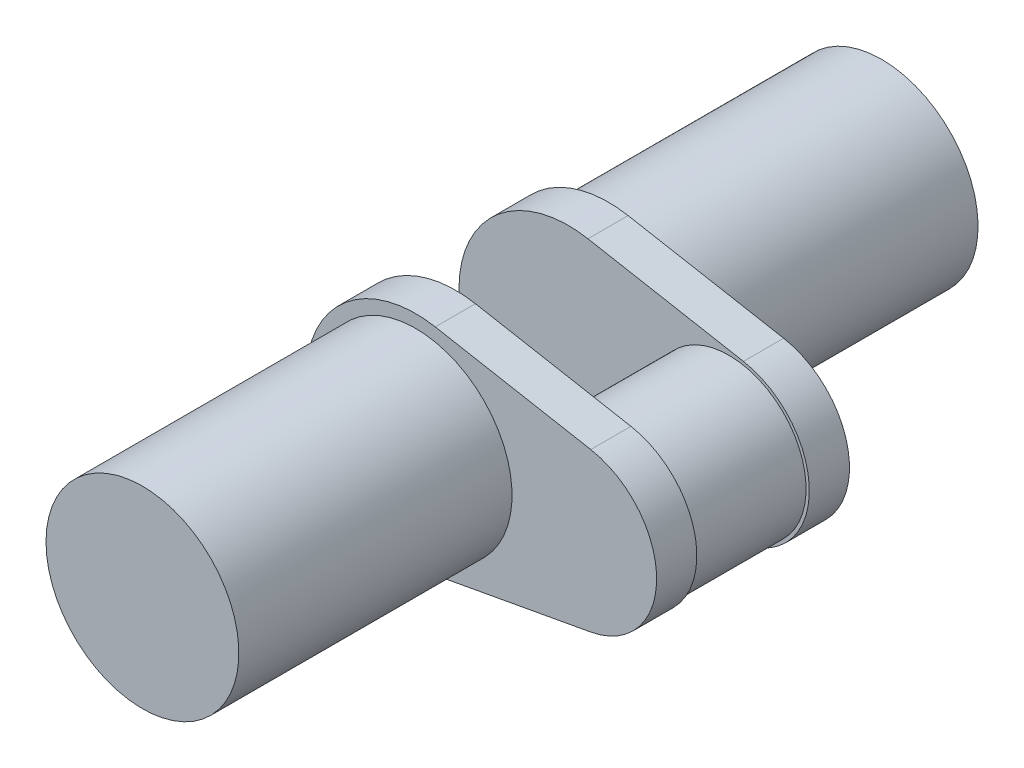
ISO-10303-21;
HEADER;
FILE_DESCRIPTION(('STEP AP214'),'2;1');
FILE_NAME('part.step','',(''),(''),'','','');
FILE_SCHEMA(('AUTOMOTIVE_DESIGN { 1 0 10303 214 1 1 1 1 }'));
ENDSEC;
DATA;
#1=APPLICATION_CONTEXT('core data for automotive mechanical design processes');
#2=APPLICATION_PROTOCOL_DEFINITION('international standard','automotive_design',2000,#1);
#3=PRODUCT_CONTEXT('',#1,'mechanical');
#4=PRODUCT('Part','Part','',(#3));
#5=PRODUCT_RELATED_PRODUCT_CATEGORY('part','',(#4));
#6=PRODUCT_DEFINITION_FORMATION('','',#4);
#7=PRODUCT_DEFINITION_CONTEXT('part definition',#1,'design');
#8=PRODUCT_DEFINITION('design','',#6,#7);
#9=PRODUCT_DEFINITION_SHAPE('','',#8);
#10=(LENGTH_UNIT() NAMED_UNIT(*) SI_UNIT(.MILLI.,.METRE.));
#11=(NAMED_UNIT(*) PLANE_ANGLE_UNIT() SI_UNIT($,.RADIAN.));
#12=(NAMED_UNIT(*) SI_UNIT($,.STERADIAN.) SOLID_ANGLE_UNIT());
#13=UNCERTAINTY_MEASURE_WITH_UNIT(LENGTH_MEASURE(1.E-05),#10,'distance_accuracy_value','');
#14=(GEOMETRIC_REPRESENTATION_CONTEXT(3) GLOBAL_UNCERTAINTY_ASSIGNED_CONTEXT((#13)) GLOBAL_UNIT_ASSIGNED_CONTEXT((#10,
#11,#12)) REPRESENTATION_CONTEXT('',''));
#15=CARTESIAN_POINT('',(0.,0.,0.));
#16=DIRECTION('',(0.,0.,1.));
#17=DIRECTION('',(1.,0.,0.));
#18=AXIS2_PLACEMENT_3D('',#15,#16,#17);
#19=CARTESIAN_POINT('',(-19.2786,-19.2786,0.));
#20=DIRECTION('',(0.,0.,1.));
#21=DIRECTION('',(1.,0.,0.));
#22=AXIS2_PLACEMENT_3D('',#19,#20,#21);
#23=PLANE('',#22);
#24=CARTESIAN_POINT('',(0.,0.,0.));
#25=DIRECTION('',(0.,0.,-1.));
#26=DIRECTION('',(-1.,0.,0.));
#27=AXIS2_PLACEMENT_3D('',#24,#25,#26);
#28=CIRCLE('',#27,19.05);
#29=CARTESIAN_POINT('',(-19.05,0.,0.));
#30=VERTEX_POINT('',#29);
#31=EDGE_CURVE('E20',#30,#30,#28,.F.);
#32=ORIENTED_EDGE('',*,*,#31,.T.);
#33=EDGE_LOOP('',(#32));
#34=FACE_BOUND('',#33,.T.);
#35=ADVANCED_FACE('F16',(#34),#23,.T.);
#36=CARTESIAN_POINT('',(0.,0.,0.));
#37=DIRECTION('',(0.,0.,-1.));
#38=DIRECTION('',(-1.,0.,0.));
#39=AXIS2_PLACEMENT_3D('',#36,#37,#38);
#40=CYLINDRICAL_SURFACE('',#39,19.05);
#41=CARTESIAN_POINT('',(0.,0.,-53.975));
#42=DIRECTION('',(0.,0.,-1.));
#43=DIRECTION('',(-1.,0.,0.));
#44=AXIS2_PLACEMENT_3D('',#41,#42,#43);
#45=CIRCLE('',#44,19.05);
#46=CARTESIAN_POINT('',(-19.05,0.,-53.975));
#47=VERTEX_POINT('',#46);
#48=EDGE_CURVE('E89',#47,#47,#45,.F.);
#49=ORIENTED_EDGE('',*,*,#48,.T.);
#50=EDGE_LOOP('',(#49));
#51=FACE_BOUND('',#50,.T.);
#52=ORIENTED_EDGE('',*,*,#31,.F.);
#53=EDGE_LOOP('',(#52));
#54=FACE_BOUND('',#53,.T.);
#55=ADVANCED_FACE('F153',(#51,#54),#40,.T.);
#56=CARTESIAN_POINT('',(48.04029,-21.84908,-53.975));
#57=DIRECTION('',(0.,0.,-1.));
#58=DIRECTION('',(-1.,0.,0.));
#59=AXIS2_PLACEMENT_3D('',#56,#57,#58);
#60=PLANE('',#59);
#61=ORIENTED_EDGE('',*,*,#48,.F.);
#62=EDGE_LOOP('',(#61));
#63=FACE_BOUND('',#62,.T.);
#64=DIRECTION('',(-0.983666610086747,-0.1800000005568,0.));
#65=VECTOR('',#64,1.);
#66=CARTESIAN_POINT('',(19.24685,-18.426534775,-53.975));
#67=LINE('',#66,#65);
#68=CARTESIAN_POINT('',(34.6075000035923,-15.6157074267427,-53.975));
#69=VERTEX_POINT('',#68);
#70=CARTESIAN_POINT('',(3.88620000677444,-21.2373621213604,-53.975));
#71=VERTEX_POINT('',#70);
#72=EDGE_CURVE('E107',#69,#71,#67,.T.);
#73=ORIENTED_EDGE('',*,*,#72,.F.);
#74=CARTESIAN_POINT('',(31.75,0.,-53.975));
#75=DIRECTION('',(0.,0.,-1.));
#76=DIRECTION('',(0.,1.,0.));
#77=AXIS2_PLACEMENT_3D('',#74,#75,#76);
#78=CIRCLE('',#77,15.875);
#79=CARTESIAN_POINT('',(34.6075000032687,15.6157074314742,-53.975));
#80=VERTEX_POINT('',#79);
#81=EDGE_CURVE('E94',#69,#80,#78,.F.);
#82=ORIENTED_EDGE('',*,*,#81,.T.);
#83=DIRECTION('',(0.983666610086747,-0.1800000005568,0.));
#84=VECTOR('',#83,1.);
#85=CARTESIAN_POINT('',(19.24685,18.426534775,-53.975));
#86=LINE('',#85,#84);
#87=CARTESIAN_POINT('',(3.88620000677444,21.2373621213604,-53.975));
#88=VERTEX_POINT('',#87);
#89=EDGE_CURVE('E92',#88,#80,#86,.T.);
#90=ORIENTED_EDGE('',*,*,#89,.F.);
#91=CARTESIAN_POINT('',(0.,0.,-53.975));
#92=DIRECTION('',(0.,0.,-1.));
#93=DIRECTION('',(0.,1.,0.));
#94=AXIS2_PLACEMENT_3D('',#91,#92,#93);
#95=CIRCLE('',#94,21.59);
#96=EDGE_CURVE('E78',#88,#71,#95,.F.);
#97=ORIENTED_EDGE('',*,*,#96,.T.);
#98=EDGE_LOOP('',(#73,#82,#90,#97));
#99=FACE_BOUND('',#98,.T.);
#100=ADVANCED_FACE('F93',(#63,#99),#60,.F.);
#101=CARTESIAN_POINT('',(0.,0.,-53.975));
#102=DIRECTION('',(0.,0.,-1.));
#103=DIRECTION('',(0.,1.,0.));
#104=AXIS2_PLACEMENT_3D('',#101,#102,#103);
#105=CYLINDRICAL_SURFACE('',#104,21.59);
#106=ORIENTED_EDGE('',*,*,#96,.F.);
#107=DIRECTION('',(0.,0.,1.));
#108=VECTOR('',#107,1.);
#109=CARTESIAN_POINT('',(3.8862,21.2373621226,-57.94375));
#110=LINE('',#109,#108);
#111=CARTESIAN_POINT('',(3.88620001567664,21.2373621263321,-61.9125));
#112=VERTEX_POINT('',#111);
#113=EDGE_CURVE('E82',#112,#88,#110,.T.);
#114=ORIENTED_EDGE('',*,*,#113,.F.);
#115=CARTESIAN_POINT('',(0.,0.,-61.9125));
#116=DIRECTION('',(0.,0.,-1.));
#117=DIRECTION('',(0.,1.,0.));
#118=AXIS2_PLACEMENT_3D('',#115,#116,#117);
#119=CIRCLE('',#118,21.59);
#120=CARTESIAN_POINT('',(3.88620001567664,-21.2373621263321,-61.9125));
#121=VERTEX_POINT('',#120);
#122=EDGE_CURVE('E144',#121,#112,#119,.T.);
#123=ORIENTED_EDGE('',*,*,#122,.F.);
#124=DIRECTION('',(0.,0.,-1.));
#125=VECTOR('',#124,1.);
#126=CARTESIAN_POINT('',(3.8862,-21.2373621226,-57.94375));
#127=LINE('',#126,#125);
#128=EDGE_CURVE('E85',#71,#121,#127,.T.);
#129=ORIENTED_EDGE('',*,*,#128,.F.);
#130=EDGE_LOOP('',(#106,#114,#123,#129));
#131=FACE_BOUND('',#130,.T.);
#132=ADVANCED_FACE('F80',(#131),#105,.T.);
#133=CARTESIAN_POINT('',(34.6075,15.6157074274,-61.9125));
#134=DIRECTION('',(0.1800000005568,0.983666610086747,0.));
#135=DIRECTION('',(-0.983666610086747,0.1800000005568,0.));
#136=AXIS2_PLACEMENT_3D('',#133,#134,#135);
#137=PLANE('',#136);
#138=ORIENTED_EDGE('',*,*,#89,.T.);
#139=DIRECTION('',(0.,0.,1.));
#140=VECTOR('',#139,1.);
#141=CARTESIAN_POINT('',(34.6074999993528,15.615707436863,-57.94375));
#142=LINE('',#141,#140);
#143=CARTESIAN_POINT('',(34.6075000080767,15.6157074256334,-61.9125));
#144=VERTEX_POINT('',#143);
#145=EDGE_CURVE('E105',#80,#144,#142,.F.);
#146=ORIENTED_EDGE('',*,*,#145,.T.);
#147=DIRECTION('',(0.983666609955655,-0.180000001273195,0.));
#148=VECTOR('',#147,1.);
#149=CARTESIAN_POINT('',(3.88620002828036,21.2373621306264,-61.9125));
#150=LINE('',#149,#148);
#151=EDGE_CURVE('E100',#112,#144,#150,.T.);
#152=ORIENTED_EDGE('',*,*,#151,.F.);
#153=ORIENTED_EDGE('',*,*,#113,.T.);
#154=EDGE_LOOP('',(#138,#146,#152,#153));
#155=FACE_BOUND('',#154,.T.);
#156=ADVANCED_FACE('F98',(#155),#137,.T.);
#157=CARTESIAN_POINT('',(31.75,0.,-53.975));
#158=DIRECTION('',(0.,0.,-1.));
#159=DIRECTION('',(0.,1.,0.));
#160=AXIS2_PLACEMENT_3D('',#157,#158,#159);
#161=CYLINDRICAL_SURFACE('',#160,15.875);
#162=ORIENTED_EDGE('',*,*,#145,.F.);
#163=ORIENTED_EDGE('',*,*,#81,.F.);
#164=DIRECTION('',(0.,0.,1.));
#165=VECTOR('',#164,1.);
#166=CARTESIAN_POINT('',(34.6075,-15.6157074274,-57.94375));
#167=LINE('',#166,#165);
#168=CARTESIAN_POINT('',(34.6075000084003,-15.6157074209019,-61.9125));
#169=VERTEX_POINT('',#168);
#170=EDGE_CURVE('E108',#169,#69,#167,.T.);
#171=ORIENTED_EDGE('',*,*,#170,.F.);
#172=CARTESIAN_POINT('',(31.75,0.,-61.9125));
#173=DIRECTION('',(0.,0.,-1.));
#174=DIRECTION('',(0.,1.,0.));
#175=AXIS2_PLACEMENT_3D('',#172,#173,#174);
#176=CIRCLE('',#175,15.875);
#177=EDGE_CURVE('E140',#144,#169,#176,.T.);
#178=ORIENTED_EDGE('',*,*,#177,.F.);
#179=EDGE_LOOP('',(#162,#163,#171,#178));
#180=FACE_BOUND('',#179,.T.);
#181=ADVANCED_FACE('F192',(#180),#161,.T.);
#182=CARTESIAN_POINT('',(3.8862,-21.2373621226,-61.9125));
#183=DIRECTION('',(0.1800000005568,-0.983666610086747,0.));
#184=DIRECTION('',(0.983666610086747,0.1800000005568,0.));
#185=AXIS2_PLACEMENT_3D('',#182,#183,#184);
#186=PLANE('',#185);
#187=ORIENTED_EDGE('',*,*,#72,.T.);
#188=ORIENTED_EDGE('',*,*,#128,.T.);
#189=DIRECTION('',(-0.983666609955655,-0.180000001273195,0.));
#190=VECTOR('',#189,1.);
#191=CARTESIAN_POINT('',(34.6074999963602,-15.6157074181442,-61.9125));
#192=LINE('',#191,#190);
#193=EDGE_CURVE('E137',#169,#121,#192,.T.);
#194=ORIENTED_EDGE('',*,*,#193,.F.);
#195=ORIENTED_EDGE('',*,*,#170,.T.);
#196=EDGE_LOOP('',(#187,#188,#194,#195));
#197=FACE_BOUND('',#196,.T.);
#198=ADVANCED_FACE('F194',(#197),#186,.T.);
#199=CARTESIAN_POINT('',(48.04029,-21.84908,-61.9125));
#200=DIRECTION('',(0.,0.,-1.));
#201=DIRECTION('',(-1.,0.,0.));
#202=AXIS2_PLACEMENT_3D('',#199,#200,#201);
#203=PLANE('',#202);
#204=CARTESIAN_POINT('',(31.75,0.,-61.9125));
#205=DIRECTION('',(0.,0.,-1.));
#206=DIRECTION('',(-1.,0.,0.));
#207=AXIS2_PLACEMENT_3D('',#204,#205,#206);
#208=CIRCLE('',#207,15.24);
#209=CARTESIAN_POINT('',(16.51,0.,-61.9125));
#210=VERTEX_POINT('',#209);
#211=EDGE_CURVE('E134',#210,#210,#208,.F.);
#212=ORIENTED_EDGE('',*,*,#211,.T.);
#213=EDGE_LOOP('',(#212));
#214=FACE_BOUND('',#213,.T.);
#215=ORIENTED_EDGE('',*,*,#177,.T.);
#216=ORIENTED_EDGE('',*,*,#193,.T.);
#217=ORIENTED_EDGE('',*,*,#122,.T.);
#218=ORIENTED_EDGE('',*,*,#151,.T.);
#219=EDGE_LOOP('',(#215,#216,#217,#218));
#220=FACE_BOUND('',#219,.T.);
#221=ADVANCED_FACE('F190',(#214,#220),#203,.T.);
#222=CARTESIAN_POINT('',(31.75,0.,-61.9125));
#223=DIRECTION('',(0.,0.,-1.));
#224=DIRECTION('',(-1.,0.,0.));
#225=AXIS2_PLACEMENT_3D('',#222,#223,#224);
#226=CYLINDRICAL_SURFACE('',#225,15.24);
#227=ORIENTED_EDGE('',*,*,#211,.F.);
#228=EDGE_LOOP('',(#227));
#229=FACE_BOUND('',#228,.T.);
#230=CARTESIAN_POINT('',(31.75,0.,-84.1375));
#231=DIRECTION('',(0.,0.,-1.));
#232=DIRECTION('',(-1.,0.,0.));
#233=AXIS2_PLACEMENT_3D('',#230,#231,#232);
#234=CIRCLE('',#233,15.24);
#235=CARTESIAN_POINT('',(16.51,0.,-84.1375));
#236=VERTEX_POINT('',#235);
#237=EDGE_CURVE('E131',#236,#236,#234,.F.);
#238=ORIENTED_EDGE('',*,*,#237,.T.);
#239=EDGE_LOOP('',(#238));
#240=FACE_BOUND('',#239,.T.);
#241=ADVANCED_FACE('F187',(#229,#240),#226,.T.);
#242=CARTESIAN_POINT('',(48.04029,-21.84908,-84.1375));
#243=DIRECTION('',(0.,0.,-1.));
#244=DIRECTION('',(-1.,0.,0.));
#245=AXIS2_PLACEMENT_3D('',#242,#243,#244);
#246=PLANE('',#245);
#247=ORIENTED_EDGE('',*,*,#237,.F.);
#248=EDGE_LOOP('',(#247));
#249=FACE_BOUND('',#248,.T.);
#250=DIRECTION('',(0.983666610086747,-0.1800000005568,0.));
#251=VECTOR('',#250,1.);
#252=CARTESIAN_POINT('',(19.24685,18.426534775,-84.1375));
#253=LINE('',#252,#251);
#254=CARTESIAN_POINT('',(3.88620000677444,21.2373621213604,-84.1375));
#255=VERTEX_POINT('',#254);
#256=CARTESIAN_POINT('',(34.6075000035923,15.6157074267427,-84.1375));
#257=VERTEX_POINT('',#256);
#258=EDGE_CURVE('E324',#255,#257,#253,.T.);
#259=ORIENTED_EDGE('',*,*,#258,.F.);
#260=CARTESIAN_POINT('',(0.,0.,-84.1375));
#261=DIRECTION('',(0.,0.,-1.));
#262=DIRECTION('',(-1.,0.,0.));
#263=AXIS2_PLACEMENT_3D('',#260,#261,#262);
#264=CIRCLE('',#263,21.59);
#265=CARTESIAN_POINT('',(3.88620000824132,-21.2373621167783,-84.1375));
#266=VERTEX_POINT('',#265);
#267=EDGE_CURVE('E125',#255,#266,#264,.F.);
#268=ORIENTED_EDGE('',*,*,#267,.T.);
#269=DIRECTION('',(-0.983666610086747,-0.1800000005568,0.));
#270=VECTOR('',#269,1.);
#271=CARTESIAN_POINT('',(19.24685,-18.426534775,-84.1375));
#272=LINE('',#271,#270);
#273=CARTESIAN_POINT('',(34.6075000035923,-15.6157074267427,-84.1375));
#274=VERTEX_POINT('',#273);
#275=EDGE_CURVE('E333',#274,#266,#272,.T.);
#276=ORIENTED_EDGE('',*,*,#275,.F.);
#277=CARTESIAN_POINT('',(31.75,0.,-84.1375));
#278=DIRECTION('',(0.,0.,-1.));
#279=DIRECTION('',(-1.,0.,0.));
#280=AXIS2_PLACEMENT_3D('',#277,#278,#279);
#281=CIRCLE('',#280,15.875);
#282=EDGE_CURVE('E128',#274,#257,#281,.F.);
#283=ORIENTED_EDGE('',*,*,#282,.T.);
#284=EDGE_LOOP('',(#259,#268,#276,#283));
#285=FACE_BOUND('',#284,.T.);
#286=ADVANCED_FACE('F185',(#249,#285),#246,.F.);
#287=CARTESIAN_POINT('',(31.75,0.,-84.1375));
#288=DIRECTION('',(0.,0.,-1.));
#289=DIRECTION('',(-1.,0.,0.));
#290=AXIS2_PLACEMENT_3D('',#287,#288,#289);
#291=CYLINDRICAL_SURFACE('',#290,15.875);
#292=DIRECTION('',(0.,0.,-1.));
#293=VECTOR('',#292,1.);
#294=CARTESIAN_POINT('',(34.6075,15.6157074274,-88.10625));
#295=LINE('',#294,#293);
#296=CARTESIAN_POINT('',(34.6075000084003,15.6157074209019,-92.075));
#297=VERTEX_POINT('',#296);
#298=EDGE_CURVE('E124',#257,#297,#295,.T.);
#299=ORIENTED_EDGE('',*,*,#298,.F.);
#300=ORIENTED_EDGE('',*,*,#282,.F.);
#301=DIRECTION('',(0.,0.,1.));
#302=VECTOR('',#301,1.);
#303=CARTESIAN_POINT('',(34.6075,-15.6157074274,-88.10625));
#304=LINE('',#303,#302);
#305=CARTESIAN_POINT('',(34.6075000084003,-15.6157074209019,-92.075));
#306=VERTEX_POINT('',#305);
#307=EDGE_CURVE('E130',#306,#274,#304,.T.);
#308=ORIENTED_EDGE('',*,*,#307,.F.);
#309=CARTESIAN_POINT('',(31.75,0.,-92.075));
#310=DIRECTION('',(0.,0.,-1.));
#311=DIRECTION('',(-1.,0.,0.));
#312=AXIS2_PLACEMENT_3D('',#309,#310,#311);
#313=CIRCLE('',#312,15.875);
#314=EDGE_CURVE('E121',#297,#306,#313,.T.);
#315=ORIENTED_EDGE('',*,*,#314,.F.);
#316=EDGE_LOOP('',(#299,#300,#308,#315));
#317=FACE_BOUND('',#316,.T.);
#318=ADVANCED_FACE('F182',(#317),#291,.T.);
#319=CARTESIAN_POINT('',(3.8862,-21.2373621226,-92.075));
#320=DIRECTION('',(0.1800000005568,-0.983666610086747,0.));
#321=DIRECTION('',(0.983666610086747,0.1800000005568,0.));
#322=AXIS2_PLACEMENT_3D('',#319,#320,#321);
#323=PLANE('',#322);
#324=ORIENTED_EDGE('',*,*,#275,.T.);
#325=DIRECTION('',(0.,0.,1.));
#326=VECTOR('',#325,1.);
#327=CARTESIAN_POINT('',(3.88620000293377,-21.2373621134358,-88.10625));
#328=LINE('',#327,#326);
#329=CARTESIAN_POINT('',(3.88620001714352,-21.2373621217499,-92.075));
#330=VERTEX_POINT('',#329);
#331=EDGE_CURVE('E127',#266,#330,#328,.F.);
#332=ORIENTED_EDGE('',*,*,#331,.T.);
#333=DIRECTION('',(-0.983666609955655,-0.180000001273195,0.));
#334=VECTOR('',#333,1.);
#335=CARTESIAN_POINT('',(34.6074999963602,-15.6157074181442,-92.075));
#336=LINE('',#335,#334);
#337=EDGE_CURVE('E118',#306,#330,#336,.T.);
#338=ORIENTED_EDGE('',*,*,#337,.F.);
#339=ORIENTED_EDGE('',*,*,#307,.T.);
#340=EDGE_LOOP('',(#324,#332,#338,#339));
#341=FACE_BOUND('',#340,.T.);
#342=ADVANCED_FACE('F181',(#341),#323,.T.);
#343=CARTESIAN_POINT('',(0.,0.,-84.1375));
#344=DIRECTION('',(0.,0.,-1.));
#345=DIRECTION('',(-1.,0.,0.));
#346=AXIS2_PLACEMENT_3D('',#343,#344,#345);
#347=CYLINDRICAL_SURFACE('',#346,21.59);
#348=ORIENTED_EDGE('',*,*,#267,.F.);
#349=DIRECTION('',(0.,0.,1.));
#350=VECTOR('',#349,1.);
#351=CARTESIAN_POINT('',(3.8862,21.2373621226,-88.10625));
#352=LINE('',#351,#350);
#353=CARTESIAN_POINT('',(3.88620001567664,21.2373621263321,-92.075));
#354=VERTEX_POINT('',#353);
#355=EDGE_CURVE('E35',#354,#255,#352,.T.);
#356=ORIENTED_EDGE('',*,*,#355,.F.);
#357=CARTESIAN_POINT('',(0.,0.,-92.075));
#358=DIRECTION('',(0.,0.,-1.));
#359=DIRECTION('',(-1.,0.,0.));
#360=AXIS2_PLACEMENT_3D('',#357,#358,#359);
#361=CIRCLE('',#360,21.59);
#362=EDGE_CURVE('E115',#330,#354,#361,.T.);
#363=ORIENTED_EDGE('',*,*,#362,.F.);
#364=ORIENTED_EDGE('',*,*,#331,.F.);
#365=EDGE_LOOP('',(#348,#356,#363,#364));
#366=FACE_BOUND('',#365,.T.);
#367=ADVANCED_FACE('F177',(#366),#347,.T.);
#368=CARTESIAN_POINT('',(34.6075,15.6157074274,-92.075));
#369=DIRECTION('',(0.1800000005568,0.983666610086747,0.));
#370=DIRECTION('',(-0.983666610086747,0.1800000005568,0.));
#371=AXIS2_PLACEMENT_3D('',#368,#369,#370);
#372=PLANE('',#371);
#373=ORIENTED_EDGE('',*,*,#258,.T.);
#374=ORIENTED_EDGE('',*,*,#298,.T.);
#375=DIRECTION('',(0.983666609955655,-0.180000001273195,0.));
#376=VECTOR('',#375,1.);
#377=CARTESIAN_POINT('',(3.88620002828036,21.2373621306264,-92.075));
#378=LINE('',#377,#376);
#379=EDGE_CURVE('E112',#354,#297,#378,.T.);
#380=ORIENTED_EDGE('',*,*,#379,.F.);
#381=ORIENTED_EDGE('',*,*,#355,.T.);
#382=EDGE_LOOP('',(#373,#374,#380,#381));
#383=FACE_BOUND('',#382,.T.);
#384=ADVANCED_FACE('F180',(#383),#372,.T.);
#385=CARTESIAN_POINT('',(19.2786,-19.2786,-146.05));
#386=DIRECTION('',(0.,0.,-1.));
#387=DIRECTION('',(-1.,0.,0.));
#388=AXIS2_PLACEMENT_3D('',#385,#386,#387);
#389=PLANE('',#388);
#390=CARTESIAN_POINT('',(0.,0.,-146.05));
#391=DIRECTION('',(0.,0.,-1.));
#392=DIRECTION('',(0.,1.,0.));
#393=AXIS2_PLACEMENT_3D('',#390,#391,#392);
#394=CIRCLE('',#393,19.05);
#395=CARTESIAN_POINT('',(0.,19.05,-146.05));
#396=VERTEX_POINT('',#395);
#397=EDGE_CURVE('E26',#396,#396,#394,.T.);
#398=ORIENTED_EDGE('',*,*,#397,.T.);
#399=EDGE_LOOP('',(#398));
#400=FACE_BOUND('',#399,.T.);
#401=ADVANCED_FACE('F172',(#400),#389,.T.);
#402=CARTESIAN_POINT('',(48.04029,-21.84908,-92.075));
#403=DIRECTION('',(0.,0.,-1.));
#404=DIRECTION('',(-1.,0.,0.));
#405=AXIS2_PLACEMENT_3D('',#402,#403,#404);
#406=PLANE('',#405);
#407=CARTESIAN_POINT('',(0.,0.,-92.075));
#408=DIRECTION('',(0.,0.,-1.));
#409=DIRECTION('',(0.,1.,0.));
#410=AXIS2_PLACEMENT_3D('',#407,#408,#409);
#411=CIRCLE('',#410,19.05);
#412=CARTESIAN_POINT('',(0.,19.05,-92.075));
#413=VERTEX_POINT('',#412);
#414=EDGE_CURVE('E11',#413,#413,#411,.F.);
#415=ORIENTED_EDGE('',*,*,#414,.T.);
#416=EDGE_LOOP('',(#415));
#417=FACE_BOUND('',#416,.T.);
#418=ORIENTED_EDGE('',*,*,#362,.T.);
#419=ORIENTED_EDGE('',*,*,#379,.T.);
#420=ORIENTED_EDGE('',*,*,#314,.T.);
#421=ORIENTED_EDGE('',*,*,#337,.T.);
#422=EDGE_LOOP('',(#418,#419,#420,#421));
#423=FACE_BOUND('',#422,.T.);
#424=ADVANCED_FACE('F18',(#417,#423),#406,.T.);
#425=CARTESIAN_POINT('',(0.,0.,-92.075));
#426=DIRECTION('',(0.,0.,-1.));
#427=DIRECTION('',(0.,1.,0.));
#428=AXIS2_PLACEMENT_3D('',#425,#426,#427);
#429=CYLINDRICAL_SURFACE('',#428,19.05);
#430=ORIENTED_EDGE('',*,*,#397,.F.);
#431=EDGE_LOOP('',(#430));
#432=FACE_BOUND('',#431,.T.);
#433=ORIENTED_EDGE('',*,*,#414,.F.);
#434=EDGE_LOOP('',(#433));
#435=FACE_BOUND('',#434,.T.);
#436=ADVANCED_FACE('F165',(#432,#435),#429,.T.);
#437=CLOSED_SHELL('',(#35,#55,#100,#132,#156,#181,#198,#221,#241,#286,#318,#342,#367,#384,#401,
#424,#436));
#438=MANIFOLD_SOLID_BREP('B1',#437);
#439=ADVANCED_BREP_SHAPE_REPRESENTATION('',(#18,#438),#14);
#440=SHAPE_DEFINITION_REPRESENTATION(#9,#439);
ENDSEC;
END-ISO-10303-21;
